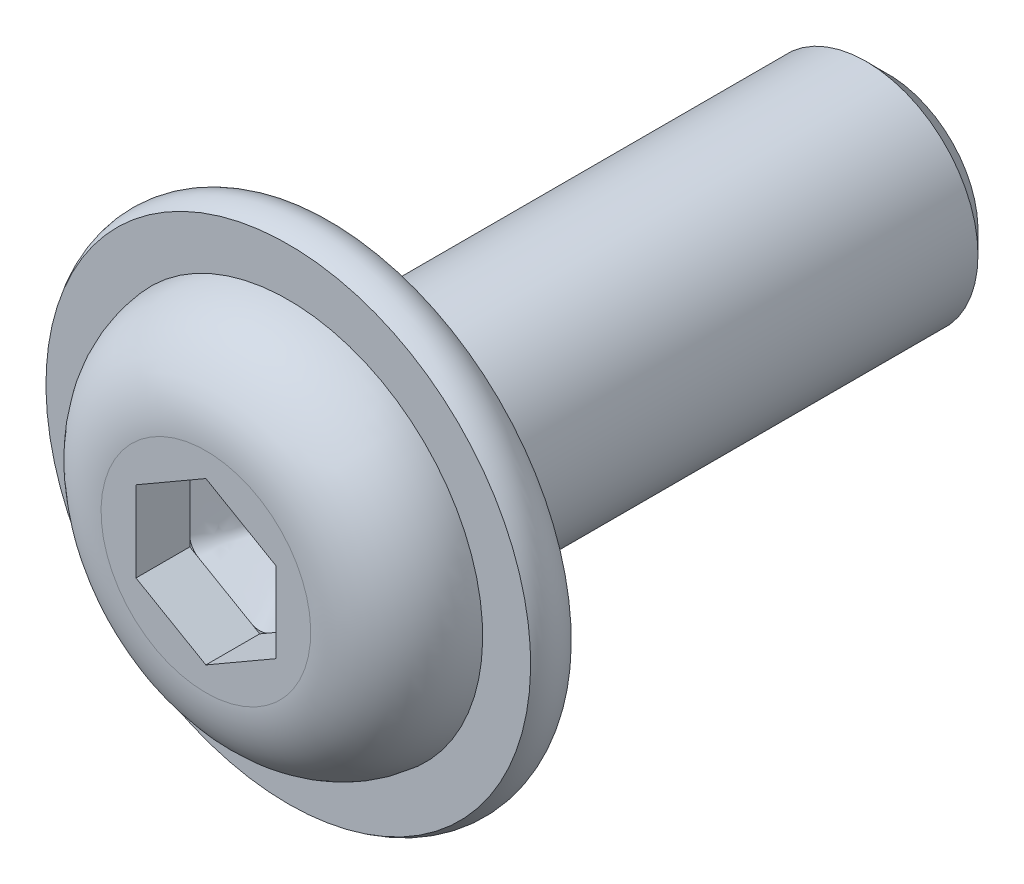
ISO-10303-21;
HEADER;
FILE_DESCRIPTION(('STEP AP214'),'2;1');
FILE_NAME('part.step','',(''),(''),'','','');
FILE_SCHEMA(('AUTOMOTIVE_DESIGN { 1 0 10303 214 1 1 1 1 }'));
ENDSEC;
DATA;
#1=APPLICATION_CONTEXT('core data for automotive mechanical design processes');
#2=APPLICATION_PROTOCOL_DEFINITION('international standard','automotive_design',2000,#1);
#3=PRODUCT_CONTEXT('',#1,'mechanical');
#4=PRODUCT('Part','Part','',(#3));
#5=PRODUCT_RELATED_PRODUCT_CATEGORY('part','',(#4));
#6=PRODUCT_DEFINITION_FORMATION('','',#4);
#7=PRODUCT_DEFINITION_CONTEXT('part definition',#1,'design');
#8=PRODUCT_DEFINITION('design','',#6,#7);
#9=PRODUCT_DEFINITION_SHAPE('','',#8);
#10=(LENGTH_UNIT() NAMED_UNIT(*) SI_UNIT(.MILLI.,.METRE.));
#11=(NAMED_UNIT(*) PLANE_ANGLE_UNIT() SI_UNIT($,.RADIAN.));
#12=(NAMED_UNIT(*) SI_UNIT($,.STERADIAN.) SOLID_ANGLE_UNIT());
#13=UNCERTAINTY_MEASURE_WITH_UNIT(LENGTH_MEASURE(1.E-05),#10,'distance_accuracy_value','');
#14=(GEOMETRIC_REPRESENTATION_CONTEXT(3) GLOBAL_UNCERTAINTY_ASSIGNED_CONTEXT((#13)) GLOBAL_UNIT_ASSIGNED_CONTEXT((#10,
#11,#12)) REPRESENTATION_CONTEXT('',''));
#15=CARTESIAN_POINT('',(0.,0.,0.));
#16=DIRECTION('',(0.,0.,1.));
#17=DIRECTION('',(1.,0.,0.));
#18=AXIS2_PLACEMENT_3D('',#15,#16,#17);
#19=CARTESIAN_POINT('',(0.,0.,10.275));
#20=DIRECTION('',(0.,0.,1.));
#21=DIRECTION('',(1.,0.,0.));
#22=AXIS2_PLACEMENT_3D('',#19,#20,#21);
#23=PLANE('',#22);
#24=CARTESIAN_POINT('',(-1.875,1.08253175473054,10.275));
#25=DIRECTION('',(0.,0.,1.));
#26=DIRECTION('',(1.,0.,0.));
#27=AXIS2_PLACEMENT_3D('',#24,#25,#26);
#28=CIRCLE('',#27,0.625);
#29=CARTESIAN_POINT('',(-2.1875,1.62379763209582,10.275));
#30=VERTEX_POINT('',#29);
#31=CARTESIAN_POINT('',(-2.5,1.08253175475083,10.275));
#32=VERTEX_POINT('',#31);
#33=EDGE_CURVE('E518',#30,#32,#28,.T.);
#34=ORIENTED_EDGE('',*,*,#33,.F.);
#35=DIRECTION('',(-0.866025403784438,-0.5,0.));
#36=VECTOR('',#35,1.);
#37=CARTESIAN_POINT('',(0.,2.88675134594813,10.275));
#38=LINE('',#37,#36);
#39=CARTESIAN_POINT('',(-2.5,1.44337567297406,10.275));
#40=VERTEX_POINT('',#39);
#41=EDGE_CURVE('E371',#30,#40,#38,.T.);
#42=ORIENTED_EDGE('',*,*,#41,.T.);
#43=DIRECTION('',(0.,-1.,0.));
#44=VECTOR('',#43,1.);
#45=CARTESIAN_POINT('',(-2.5,1.44337567297406,10.275));
#46=LINE('',#45,#44);
#47=EDGE_CURVE('E380',#40,#32,#46,.T.);
#48=ORIENTED_EDGE('',*,*,#47,.T.);
#49=EDGE_LOOP('',(#34,#42,#48));
#50=FACE_BOUND('',#49,.T.);
#51=ADVANCED_FACE('F261',(#50),#23,.T.);
#52=CARTESIAN_POINT('',(-1.875,-1.08253175473055,10.275));
#53=DIRECTION('',(0.,0.,1.));
#54=DIRECTION('',(-1.,0.,0.));
#55=AXIS2_PLACEMENT_3D('',#52,#53,#54);
#56=CIRCLE('',#55,0.625);
#57=CARTESIAN_POINT('',(-2.5,-1.08253175480025,10.275));
#58=VERTEX_POINT('',#57);
#59=CARTESIAN_POINT('',(-2.18749999999958,-1.62379763209607,10.275));
#60=VERTEX_POINT('',#59);
#61=EDGE_CURVE('E509',#58,#60,#56,.T.);
#62=ORIENTED_EDGE('',*,*,#61,.F.);
#63=CARTESIAN_POINT('',(-2.5,-1.44337567297407,10.275));
#64=VERTEX_POINT('',#63);
#65=EDGE_CURVE('E378',#58,#64,#46,.T.);
#66=ORIENTED_EDGE('',*,*,#65,.T.);
#67=DIRECTION('',(0.866025403784439,-0.5,0.));
#68=VECTOR('',#67,1.);
#69=CARTESIAN_POINT('',(-2.5,-1.44337567297407,10.275));
#70=LINE('',#69,#68);
#71=EDGE_CURVE('E403',#64,#60,#70,.T.);
#72=ORIENTED_EDGE('',*,*,#71,.T.);
#73=EDGE_LOOP('',(#62,#66,#72));
#74=FACE_BOUND('',#73,.T.);
#75=ADVANCED_FACE('F696',(#74),#23,.T.);
#76=CARTESIAN_POINT('',(0.,-2.1650635094611,10.275));
#77=DIRECTION('',(0.,0.,1.));
#78=DIRECTION('',(1.,0.,0.));
#79=AXIS2_PLACEMENT_3D('',#76,#77,#78);
#80=CIRCLE('',#79,0.625);
#81=CARTESIAN_POINT('',(-0.312500000027832,-2.7063293868103,10.275));
#82=VERTEX_POINT('',#81);
#83=CARTESIAN_POINT('',(0.31250000005148,-2.70632938679665,10.275));
#84=VERTEX_POINT('',#83);
#85=EDGE_CURVE('E583',#82,#84,#80,.T.);
#86=ORIENTED_EDGE('',*,*,#85,.F.);
#87=CARTESIAN_POINT('',(0.,-2.88675134594814,10.275));
#88=VERTEX_POINT('',#87);
#89=EDGE_CURVE('E400',#82,#88,#70,.T.);
#90=ORIENTED_EDGE('',*,*,#89,.T.);
#91=DIRECTION('',(0.866025403784438,0.5,0.));
#92=VECTOR('',#91,1.);
#93=CARTESIAN_POINT('',(0.,-2.88675134594814,10.275));
#94=LINE('',#93,#92);
#95=EDGE_CURVE('E413',#88,#84,#94,.T.);
#96=ORIENTED_EDGE('',*,*,#95,.T.);
#97=EDGE_LOOP('',(#86,#90,#96));
#98=FACE_BOUND('',#97,.T.);
#99=ADVANCED_FACE('F700',(#98),#23,.T.);
#100=CARTESIAN_POINT('',(1.875,-1.08253175473055,10.275));
#101=DIRECTION('',(0.,0.,1.));
#102=DIRECTION('',(1.,0.,0.));
#103=AXIS2_PLACEMENT_3D('',#100,#101,#102);
#104=CIRCLE('',#103,0.625);
#105=CARTESIAN_POINT('',(2.18750000000772,-1.62379763209137,10.275));
#106=VERTEX_POINT('',#105);
#107=CARTESIAN_POINT('',(2.5,-1.08253175475084,10.275));
#108=VERTEX_POINT('',#107);
#109=EDGE_CURVE('E548',#106,#108,#104,.T.);
#110=ORIENTED_EDGE('',*,*,#109,.F.);
#111=CARTESIAN_POINT('',(2.5,-1.44337567297407,10.275));
#112=VERTEX_POINT('',#111);
#113=EDGE_CURVE('E411',#106,#112,#94,.T.);
#114=ORIENTED_EDGE('',*,*,#113,.T.);
#115=DIRECTION('',(0.,1.,0.));
#116=VECTOR('',#115,1.);
#117=CARTESIAN_POINT('',(2.5,-1.44337567297407,10.275));
#118=LINE('',#117,#116);
#119=EDGE_CURVE('E427',#112,#108,#118,.T.);
#120=ORIENTED_EDGE('',*,*,#119,.T.);
#121=EDGE_LOOP('',(#110,#114,#120));
#122=FACE_BOUND('',#121,.T.);
#123=ADVANCED_FACE('F704',(#122),#23,.T.);
#124=CARTESIAN_POINT('',(1.875,1.08253175473054,10.275));
#125=DIRECTION('',(0.,0.,1.));
#126=DIRECTION('',(1.,0.,0.));
#127=AXIS2_PLACEMENT_3D('',#124,#125,#126);
#128=CIRCLE('',#127,0.625);
#129=CARTESIAN_POINT('',(2.5,1.08253175480024,10.275));
#130=VERTEX_POINT('',#129);
#131=CARTESIAN_POINT('',(2.18749999999958,1.62379763209606,10.275));
#132=VERTEX_POINT('',#131);
#133=EDGE_CURVE('E441',#130,#132,#128,.T.);
#134=ORIENTED_EDGE('',*,*,#133,.F.);
#135=CARTESIAN_POINT('',(2.5,1.44337567297406,10.275));
#136=VERTEX_POINT('',#135);
#137=EDGE_CURVE('E415',#130,#136,#118,.T.);
#138=ORIENTED_EDGE('',*,*,#137,.T.);
#139=DIRECTION('',(-0.866025403784439,0.5,0.));
#140=VECTOR('',#139,1.);
#141=CARTESIAN_POINT('',(2.5,1.44337567297406,10.275));
#142=LINE('',#141,#140);
#143=EDGE_CURVE('E432',#136,#132,#142,.T.);
#144=ORIENTED_EDGE('',*,*,#143,.T.);
#145=EDGE_LOOP('',(#134,#138,#144));
#146=FACE_BOUND('',#145,.T.);
#147=ADVANCED_FACE('F439',(#146),#23,.T.);
#148=CARTESIAN_POINT('',(0.,0.,12.2));
#149=DIRECTION('',(0.,0.,-1.));
#150=DIRECTION('',(0.,1.,0.));
#151=AXIS2_PLACEMENT_3D('',#148,#149,#150);
#152=PLANE('',#151);
#153=DIRECTION('',(0.,-1.,0.));
#154=VECTOR('',#153,1.);
#155=CARTESIAN_POINT('',(-2.5,1.44337567297406,12.2));
#156=LINE('',#155,#154);
#157=CARTESIAN_POINT('',(-2.5,1.44337567297406,12.2));
#158=VERTEX_POINT('',#157);
#159=CARTESIAN_POINT('',(-2.5,-1.44337567297407,12.2));
#160=VERTEX_POINT('',#159);
#161=EDGE_CURVE('E621',#158,#160,#156,.T.);
#162=ORIENTED_EDGE('',*,*,#161,.F.);
#163=DIRECTION('',(-0.866025403784438,-0.5,0.));
#164=VECTOR('',#163,1.);
#165=CARTESIAN_POINT('',(0.,2.88675134594813,12.2));
#166=LINE('',#165,#164);
#167=CARTESIAN_POINT('',(0.,2.88675134594813,12.2));
#168=VERTEX_POINT('',#167);
#169=EDGE_CURVE('E287',#168,#158,#166,.T.);
#170=ORIENTED_EDGE('',*,*,#169,.F.);
#171=DIRECTION('',(-0.866025403784439,0.5,0.));
#172=VECTOR('',#171,1.);
#173=CARTESIAN_POINT('',(2.5,1.44337567297406,12.2));
#174=LINE('',#173,#172);
#175=CARTESIAN_POINT('',(2.5,1.44337567297406,12.2));
#176=VERTEX_POINT('',#175);
#177=EDGE_CURVE('E382',#176,#168,#174,.T.);
#178=ORIENTED_EDGE('',*,*,#177,.F.);
#179=DIRECTION('',(0.,1.,0.));
#180=VECTOR('',#179,1.);
#181=CARTESIAN_POINT('',(2.5,-1.44337567297407,12.2));
#182=LINE('',#181,#180);
#183=CARTESIAN_POINT('',(2.5,-1.44337567297407,12.2));
#184=VERTEX_POINT('',#183);
#185=EDGE_CURVE('E449',#184,#176,#182,.T.);
#186=ORIENTED_EDGE('',*,*,#185,.F.);
#187=DIRECTION('',(0.866025403784438,0.5,0.));
#188=VECTOR('',#187,1.);
#189=CARTESIAN_POINT('',(0.,-2.88675134594814,12.2));
#190=LINE('',#189,#188);
#191=CARTESIAN_POINT('',(0.,-2.88675134594814,12.2));
#192=VERTEX_POINT('',#191);
#193=EDGE_CURVE('E628',#192,#184,#190,.T.);
#194=ORIENTED_EDGE('',*,*,#193,.F.);
#195=DIRECTION('',(0.866025403784439,-0.5,0.));
#196=VECTOR('',#195,1.);
#197=CARTESIAN_POINT('',(-2.5,-1.44337567297407,12.2));
#198=LINE('',#197,#196);
#199=EDGE_CURVE('E623',#160,#192,#198,.T.);
#200=ORIENTED_EDGE('',*,*,#199,.F.);
#201=EDGE_LOOP('',(#162,#170,#178,#186,#194,#200));
#202=FACE_BOUND('',#201,.T.);
#203=CARTESIAN_POINT('',(0.,0.,12.2));
#204=DIRECTION('',(0.,0.,1.));
#205=DIRECTION('',(0.,-1.,0.));
#206=AXIS2_PLACEMENT_3D('',#203,#204,#205);
#207=CIRCLE('',#206,3.75);
#208=CARTESIAN_POINT('',(0.,-3.75000000000001,12.2));
#209=VERTEX_POINT('',#208);
#210=EDGE_CURVE('E12',#209,#209,#207,.T.);
#211=ORIENTED_EDGE('',*,*,#210,.T.);
#212=EDGE_LOOP('',(#211));
#213=FACE_BOUND('',#212,.T.);
#214=ADVANCED_FACE('F263',(#202,#213),#152,.F.);
#215=CARTESIAN_POINT('',(0.,0.,8.98631899891452));
#216=DIRECTION('',(0.,0.,1.));
#217=DIRECTION('',(0.,-1.,0.));
#218=AXIS2_PLACEMENT_3D('',#215,#216,#217);
#219=TOROIDAL_SURFACE('',#218,3.75,3.21368100108548);
#220=ORIENTED_EDGE('',*,*,#210,.F.);
#221=EDGE_LOOP('',(#220));
#222=FACE_BOUND('',#221,.T.);
#223=CARTESIAN_POINT('',(0.,0.,9.252));
#224=DIRECTION('',(0.,0.,1.));
#225=DIRECTION('',(0.,-1.,0.));
#226=AXIS2_PLACEMENT_3D('',#223,#224,#225);
#227=CIRCLE('',#226,6.95268);
#228=CARTESIAN_POINT('',(0.,-6.95268000000001,9.252));
#229=VERTEX_POINT('',#228);
#230=EDGE_CURVE('E271',#229,#229,#227,.T.);
#231=ORIENTED_EDGE('',*,*,#230,.T.);
#232=EDGE_LOOP('',(#231));
#233=FACE_BOUND('',#232,.T.);
#234=ADVANCED_FACE('F655',(#222,#233),#219,.T.);
#235=CARTESIAN_POINT('',(0.,8.6686,9.252));
#236=DIRECTION('',(0.,0.,-1.));
#237=DIRECTION('',(0.,1.,0.));
#238=AXIS2_PLACEMENT_3D('',#235,#236,#237);
#239=PLANE('',#238);
#240=ORIENTED_EDGE('',*,*,#230,.F.);
#241=EDGE_LOOP('',(#240));
#242=FACE_BOUND('',#241,.T.);
#243=CARTESIAN_POINT('',(0.,0.,9.252));
#244=DIRECTION('',(0.,0.,1.));
#245=DIRECTION('',(0.,-1.,0.));
#246=AXIS2_PLACEMENT_3D('',#243,#244,#245);
#247=CIRCLE('',#246,8.6686);
#248=CARTESIAN_POINT('',(0.,-8.6686,9.252));
#249=VERTEX_POINT('',#248);
#250=EDGE_CURVE('E650',#249,#249,#247,.T.);
#251=ORIENTED_EDGE('',*,*,#250,.T.);
#252=EDGE_LOOP('',(#251));
#253=FACE_BOUND('',#252,.T.);
#254=ADVANCED_FACE('F657',(#242,#253),#239,.F.);
#255=CARTESIAN_POINT('',(0.,0.,8.526));
#256=DIRECTION('',(0.,0.,1.));
#257=DIRECTION('',(0.,-1.,0.));
#258=AXIS2_PLACEMENT_3D('',#255,#256,#257);
#259=TOROIDAL_SURFACE('',#258,7.64541495246326,1.25458504753674);
#260=ORIENTED_EDGE('',*,*,#250,.F.);
#261=EDGE_LOOP('',(#260));
#262=FACE_BOUND('',#261,.T.);
#263=CARTESIAN_POINT('',(0.,0.,7.8));
#264=DIRECTION('',(0.,0.,1.));
#265=DIRECTION('',(0.,-1.,0.));
#266=AXIS2_PLACEMENT_3D('',#263,#264,#265);
#267=CIRCLE('',#266,8.6686);
#268=CARTESIAN_POINT('',(0.,-8.6686,7.8));
#269=VERTEX_POINT('',#268);
#270=EDGE_CURVE('E647',#269,#269,#267,.T.);
#271=ORIENTED_EDGE('',*,*,#270,.T.);
#272=EDGE_LOOP('',(#271));
#273=FACE_BOUND('',#272,.T.);
#274=ADVANCED_FACE('F660',(#262,#273),#259,.T.);
#275=CARTESIAN_POINT('',(0.,4.,7.8));
#276=DIRECTION('',(0.,0.,1.));
#277=DIRECTION('',(0.,-1.,0.));
#278=AXIS2_PLACEMENT_3D('',#275,#276,#277);
#279=PLANE('',#278);
#280=ORIENTED_EDGE('',*,*,#270,.F.);
#281=EDGE_LOOP('',(#280));
#282=FACE_BOUND('',#281,.T.);
#283=CARTESIAN_POINT('',(0.,0.,7.8));
#284=DIRECTION('',(0.,0.,1.));
#285=DIRECTION('',(0.,-1.,0.));
#286=AXIS2_PLACEMENT_3D('',#283,#284,#285);
#287=CIRCLE('',#286,4.);
#288=CARTESIAN_POINT('',(0.,-4.00000000000001,7.8));
#289=VERTEX_POINT('',#288);
#290=EDGE_CURVE('E644',#289,#289,#287,.T.);
#291=ORIENTED_EDGE('',*,*,#290,.T.);
#292=EDGE_LOOP('',(#291));
#293=FACE_BOUND('',#292,.T.);
#294=ADVANCED_FACE('F666',(#282,#293),#279,.F.);
#295=CARTESIAN_POINT('',(0.,0.,12.2));
#296=DIRECTION('',(0.,0.,1.));
#297=DIRECTION('',(0.,-1.,0.));
#298=AXIS2_PLACEMENT_3D('',#295,#296,#297);
#299=CYLINDRICAL_SURFACE('',#298,4.);
#300=ORIENTED_EDGE('',*,*,#290,.F.);
#301=EDGE_LOOP('',(#300));
#302=FACE_BOUND('',#301,.T.);
#303=CARTESIAN_POINT('',(0.,0.,-11.41875));
#304=DIRECTION('',(0.,0.,1.));
#305=DIRECTION('',(0.,-1.,0.));
#306=AXIS2_PLACEMENT_3D('',#303,#304,#305);
#307=CIRCLE('',#306,4.);
#308=CARTESIAN_POINT('',(0.,-4.,-11.41875));
#309=VERTEX_POINT('',#308);
#310=EDGE_CURVE('E641',#309,#309,#307,.T.);
#311=ORIENTED_EDGE('',*,*,#310,.T.);
#312=EDGE_LOOP('',(#311));
#313=FACE_BOUND('',#312,.T.);
#314=ADVANCED_FACE('F672',(#302,#313),#299,.T.);
#315=CARTESIAN_POINT('',(0.,0.,-12.2));
#316=DIRECTION('',(0.,0.,1.));
#317=DIRECTION('',(0.,-1.,0.));
#318=AXIS2_PLACEMENT_3D('',#315,#316,#317);
#319=CONICAL_SURFACE('',#318,3.21875000000001,0.785398163397445);
#320=ORIENTED_EDGE('',*,*,#310,.F.);
#321=EDGE_LOOP('',(#320));
#322=FACE_BOUND('',#321,.T.);
#323=CARTESIAN_POINT('',(0.,0.,-12.2));
#324=DIRECTION('',(0.,0.,1.));
#325=DIRECTION('',(0.,-1.,0.));
#326=AXIS2_PLACEMENT_3D('',#323,#324,#325);
#327=CIRCLE('',#326,3.21875000000001);
#328=CARTESIAN_POINT('',(0.,-3.21875000000001,-12.2));
#329=VERTEX_POINT('',#328);
#330=EDGE_CURVE('E633',#329,#329,#327,.T.);
#331=ORIENTED_EDGE('',*,*,#330,.T.);
#332=EDGE_LOOP('',(#331));
#333=FACE_BOUND('',#332,.T.);
#334=ADVANCED_FACE('F678',(#322,#333),#319,.T.);
#335=CARTESIAN_POINT('',(0.,3.21875000000001,-12.2));
#336=DIRECTION('',(0.,0.,1.));
#337=DIRECTION('',(0.,-1.,0.));
#338=AXIS2_PLACEMENT_3D('',#335,#336,#337);
#339=PLANE('',#338);
#340=ORIENTED_EDGE('',*,*,#330,.F.);
#341=EDGE_LOOP('',(#340));
#342=FACE_BOUND('',#341,.T.);
#343=ADVANCED_FACE('F684',(#342),#339,.F.);
#344=CARTESIAN_POINT('',(0.,2.88675134594813,10.275));
#345=DIRECTION('',(-0.5,0.866025403784439,0.));
#346=DIRECTION('',(-0.866025403784439,-0.5,0.));
#347=AXIS2_PLACEMENT_3D('',#344,#345,#346);
#348=PLANE('',#347);
#349=ORIENTED_EDGE('',*,*,#169,.T.);
#350=DIRECTION('',(0.,0.,1.));
#351=VECTOR('',#350,1.);
#352=CARTESIAN_POINT('',(-2.5,1.44337567297406,10.275));
#353=LINE('',#352,#351);
#354=EDGE_CURVE('E458',#40,#158,#353,.T.);
#355=ORIENTED_EDGE('',*,*,#354,.F.);
#356=ORIENTED_EDGE('',*,*,#41,.F.);
#357=DIRECTION('',(-0.866025403784439,-0.5,0.));
#358=VECTOR('',#357,1.);
#359=CARTESIAN_POINT('',(-0.312499999999999,2.70632938682636,10.275));
#360=LINE('',#359,#358);
#361=CARTESIAN_POINT('',(-0.312499999999999,2.70632938682636,10.275));
#362=VERTEX_POINT('',#361);
#363=EDGE_CURVE('E356',#362,#30,#360,.T.);
#364=ORIENTED_EDGE('',*,*,#363,.F.);
#365=CARTESIAN_POINT('',(0.,2.88675134594813,10.275));
#366=VERTEX_POINT('',#365);
#367=EDGE_CURVE('E370',#366,#362,#38,.T.);
#368=ORIENTED_EDGE('',*,*,#367,.F.);
#369=DIRECTION('',(0.,0.,1.));
#370=VECTOR('',#369,1.);
#371=CARTESIAN_POINT('',(0.,2.88675134594813,10.275));
#372=LINE('',#371,#370);
#373=EDGE_CURVE('E453',#366,#168,#372,.T.);
#374=ORIENTED_EDGE('',*,*,#373,.T.);
#375=EDGE_LOOP('',(#349,#355,#356,#364,#368,#374));
#376=FACE_BOUND('',#375,.T.);
#377=ADVANCED_FACE('F369',(#376),#348,.F.);
#378=CARTESIAN_POINT('',(2.5,1.44337567297406,10.275));
#379=DIRECTION('',(0.5,0.866025403784439,0.));
#380=DIRECTION('',(-0.866025403784439,0.5,0.));
#381=AXIS2_PLACEMENT_3D('',#378,#379,#380);
#382=PLANE('',#381);
#383=ORIENTED_EDGE('',*,*,#177,.T.);
#384=ORIENTED_EDGE('',*,*,#373,.F.);
#385=CARTESIAN_POINT('',(0.312500000000005,2.70632938682637,10.275));
#386=VERTEX_POINT('',#385);
#387=EDGE_CURVE('E376',#386,#366,#142,.T.);
#388=ORIENTED_EDGE('',*,*,#387,.F.);
#389=DIRECTION('',(-0.866025403784438,0.5,0.));
#390=VECTOR('',#389,1.);
#391=CARTESIAN_POINT('',(2.1875,1.62379763209582,10.275));
#392=LINE('',#391,#390);
#393=EDGE_CURVE('E265',#132,#386,#392,.T.);
#394=ORIENTED_EDGE('',*,*,#393,.F.);
#395=ORIENTED_EDGE('',*,*,#143,.F.);
#396=DIRECTION('',(0.,0.,1.));
#397=VECTOR('',#396,1.);
#398=CARTESIAN_POINT('',(2.5,1.44337567297406,10.275));
#399=LINE('',#398,#397);
#400=EDGE_CURVE('E446',#136,#176,#399,.T.);
#401=ORIENTED_EDGE('',*,*,#400,.T.);
#402=EDGE_LOOP('',(#383,#384,#388,#394,#395,#401));
#403=FACE_BOUND('',#402,.T.);
#404=ADVANCED_FACE('F456',(#403),#382,.F.);
#405=CARTESIAN_POINT('',(2.5,-1.44337567297407,10.275));
#406=DIRECTION('',(1.,0.,0.));
#407=DIRECTION('',(0.,1.,0.));
#408=AXIS2_PLACEMENT_3D('',#405,#406,#407);
#409=PLANE('',#408);
#410=ORIENTED_EDGE('',*,*,#185,.T.);
#411=ORIENTED_EDGE('',*,*,#400,.F.);
#412=ORIENTED_EDGE('',*,*,#137,.F.);
#413=DIRECTION('',(0.,1.,0.));
#414=VECTOR('',#413,1.);
#415=CARTESIAN_POINT('',(2.5,-1.08253175473055,10.275));
#416=LINE('',#415,#414);
#417=EDGE_CURVE('E539',#108,#130,#416,.T.);
#418=ORIENTED_EDGE('',*,*,#417,.F.);
#419=ORIENTED_EDGE('',*,*,#119,.F.);
#420=DIRECTION('',(0.,0.,1.));
#421=VECTOR('',#420,1.);
#422=CARTESIAN_POINT('',(2.5,-1.44337567297407,10.275));
#423=LINE('',#422,#421);
#424=EDGE_CURVE('E454',#112,#184,#423,.T.);
#425=ORIENTED_EDGE('',*,*,#424,.T.);
#426=EDGE_LOOP('',(#410,#411,#412,#418,#419,#425));
#427=FACE_BOUND('',#426,.T.);
#428=ADVANCED_FACE('F447',(#427),#409,.F.);
#429=CARTESIAN_POINT('',(0.,-2.88675134594814,10.275));
#430=DIRECTION('',(0.5,-0.866025403784439,0.));
#431=DIRECTION('',(0.866025403784439,0.5,0.));
#432=AXIS2_PLACEMENT_3D('',#429,#430,#431);
#433=PLANE('',#432);
#434=ORIENTED_EDGE('',*,*,#193,.T.);
#435=ORIENTED_EDGE('',*,*,#424,.F.);
#436=ORIENTED_EDGE('',*,*,#113,.F.);
#437=DIRECTION('',(0.866025403784439,0.5,0.));
#438=VECTOR('',#437,1.);
#439=CARTESIAN_POINT('',(0.312499999999999,-2.70632938682637,10.275));
#440=LINE('',#439,#438);
#441=EDGE_CURVE('E576',#84,#106,#440,.T.);
#442=ORIENTED_EDGE('',*,*,#441,.F.);
#443=ORIENTED_EDGE('',*,*,#95,.F.);
#444=DIRECTION('',(0.,0.,1.));
#445=VECTOR('',#444,1.);
#446=CARTESIAN_POINT('',(0.,-2.88675134594814,10.275));
#447=LINE('',#446,#445);
#448=EDGE_CURVE('E636',#88,#192,#447,.T.);
#449=ORIENTED_EDGE('',*,*,#448,.T.);
#450=EDGE_LOOP('',(#434,#435,#436,#442,#443,#449));
#451=FACE_BOUND('',#450,.T.);
#452=ADVANCED_FACE('F561',(#451),#433,.F.);
#453=CARTESIAN_POINT('',(-2.5,-1.44337567297407,10.275));
#454=DIRECTION('',(-0.5,-0.866025403784439,0.));
#455=DIRECTION('',(0.866025403784439,-0.5,0.));
#456=AXIS2_PLACEMENT_3D('',#453,#454,#455);
#457=PLANE('',#456);
#458=ORIENTED_EDGE('',*,*,#199,.T.);
#459=ORIENTED_EDGE('',*,*,#448,.F.);
#460=ORIENTED_EDGE('',*,*,#89,.F.);
#461=DIRECTION('',(0.866025403784439,-0.5,0.));
#462=VECTOR('',#461,1.);
#463=CARTESIAN_POINT('',(-2.1875,-1.62379763209583,10.275));
#464=LINE('',#463,#462);
#465=EDGE_CURVE('E592',#60,#82,#464,.T.);
#466=ORIENTED_EDGE('',*,*,#465,.F.);
#467=ORIENTED_EDGE('',*,*,#71,.F.);
#468=DIRECTION('',(0.,0.,1.));
#469=VECTOR('',#468,1.);
#470=CARTESIAN_POINT('',(-2.5,-1.44337567297407,10.275));
#471=LINE('',#470,#469);
#472=EDGE_CURVE('E459',#64,#160,#471,.T.);
#473=ORIENTED_EDGE('',*,*,#472,.T.);
#474=EDGE_LOOP('',(#458,#459,#460,#466,#467,#473));
#475=FACE_BOUND('',#474,.T.);
#476=ADVANCED_FACE('F565',(#475),#457,.F.);
#477=CARTESIAN_POINT('',(-2.5,1.44337567297406,10.275));
#478=DIRECTION('',(-1.,0.,0.));
#479=DIRECTION('',(0.,0.,1.));
#480=AXIS2_PLACEMENT_3D('',#477,#478,#479);
#481=PLANE('',#480);
#482=ORIENTED_EDGE('',*,*,#161,.T.);
#483=ORIENTED_EDGE('',*,*,#472,.F.);
#484=ORIENTED_EDGE('',*,*,#65,.F.);
#485=DIRECTION('',(0.,-1.,0.));
#486=VECTOR('',#485,1.);
#487=CARTESIAN_POINT('',(-2.5,1.08253175473054,10.275));
#488=LINE('',#487,#486);
#489=EDGE_CURVE('E521',#32,#58,#488,.T.);
#490=ORIENTED_EDGE('',*,*,#489,.F.);
#491=ORIENTED_EDGE('',*,*,#47,.F.);
#492=ORIENTED_EDGE('',*,*,#354,.T.);
#493=EDGE_LOOP('',(#482,#483,#484,#490,#491,#492));
#494=FACE_BOUND('',#493,.T.);
#495=ADVANCED_FACE('F476',(#494),#481,.F.);
#496=CARTESIAN_POINT('',(0.,2.16506350946109,10.275));
#497=DIRECTION('',(0.,0.,1.));
#498=DIRECTION('',(1.,0.,0.));
#499=AXIS2_PLACEMENT_3D('',#496,#497,#498);
#500=CIRCLE('',#499,0.625);
#501=EDGE_CURVE('E351',#386,#362,#500,.T.);
#502=ORIENTED_EDGE('',*,*,#501,.F.);
#503=ORIENTED_EDGE('',*,*,#387,.T.);
#504=ORIENTED_EDGE('',*,*,#367,.T.);
#505=EDGE_LOOP('',(#502,#503,#504));
#506=FACE_BOUND('',#505,.T.);
#507=ADVANCED_FACE('F375',(#506),#23,.T.);
#508=CARTESIAN_POINT('',(0.,0.,8.526));
#509=DIRECTION('',(0.,0.,1.));
#510=DIRECTION('',(1.,0.,0.));
#511=AXIS2_PLACEMENT_3D('',#508,#509,#510);
#512=PLANE('',#511);
#513=CARTESIAN_POINT('',(0.,0.,8.526));
#514=DIRECTION('',(0.,0.,1.));
#515=DIRECTION('',(1.,0.,0.));
#516=AXIS2_PLACEMENT_3D('',#513,#514,#515);
#517=CIRCLE('',#516,0.175);
#518=CARTESIAN_POINT('',(0.175,0.,8.526));
#519=VERTEX_POINT('',#518);
#520=EDGE_CURVE('E372',#519,#519,#517,.T.);
#521=ORIENTED_EDGE('',*,*,#520,.T.);
#522=EDGE_LOOP('',(#521));
#523=FACE_BOUND('',#522,.T.);
#524=ADVANCED_FACE('F475',(#523),#512,.T.);
#525=CARTESIAN_POINT('',(0.312500000273664,2.70632938666836,10.275));
#526=CARTESIAN_POINT('',(0.0200738766966503,0.17384487186675,8.526));
#527=CARTESIAN_POINT('',(0.470028749259429,2.61538012103633,10.275));
#528=CARTESIAN_POINT('',(0.0318184717452628,0.172488722844182,8.526));
#529=CARTESIAN_POINT('',(0.783145089334924,2.43460231780606,10.275));
#530=CARTESIAN_POINT('',(0.0551747739118185,0.167367870211436,8.52599999999999));
#531=CARTESIAN_POINT('',(1.25,2.16506350946109,10.275));
#532=CARTESIAN_POINT('',(0.0881174254107773,0.152623857843624,8.52600000000001));
#533=CARTESIAN_POINT('',(1.71685491066507,1.89552470111611,10.275));
#534=CARTESIAN_POINT('',(0.117357440424493,0.131466690961414,8.52599999999999));
#535=CARTESIAN_POINT('',(2.02997125074057,1.71474689788585,10.275));
#536=CARTESIAN_POINT('',(0.133470379976766,0.113799966263084,8.526));
#537=CARTESIAN_POINT('',(2.23345560883067,1.59726514896665,10.275));
#538=CARTESIAN_POINT('',(0.142572876123845,0.101537532861186,8.526));
#539=CARTESIAN_POINT('',(2.3204287551678,1.53128704145715,10.275));
#540=CARTESIAN_POINT('',(0.146432390834959,0.0959986177038104,8.526));
#541=CARTESIAN_POINT('',(2.42272823404165,1.39873990564613,10.275));
#542=CARTESIAN_POINT('',(0.151635181272801,0.0875466127264664,8.526));
#543=CARTESIAN_POINT('',(2.48634129586638,1.243918233549,10.275));
#544=CARTESIAN_POINT('',(0.156353437077172,0.078814861548056,8.526));
#545=CARTESIAN_POINT('',(2.5,1.13559672098887,10.275));
#546=CARTESIAN_POINT('',(0.15922052095731,0.0727029661832637,8.526));
#547=CARTESIAN_POINT('',(2.5,0.90063322315047,10.275));
#548=CARTESIAN_POINT('',(0.165288851722029,0.0586887565810946,8.526));
#549=CARTESIAN_POINT('',(2.5,0.539077616689953,10.275));
#550=CARTESIAN_POINT('',(0.172532214336312,0.0359011792500186,8.52599999999999));
#551=CARTESIAN_POINT('',(2.5,0.,10.275));
#552=CARTESIAN_POINT('',(0.176234850821554,0.,8.52600000000001));
#553=CARTESIAN_POINT('',(2.49999999999999,-0.539077616689964,10.275));
#554=CARTESIAN_POINT('',(0.172532214336312,-0.0359011792500245,8.52599999999999));
#555=CARTESIAN_POINT('',(2.5,-0.90063322315048,10.275));
#556=CARTESIAN_POINT('',(0.165288851722029,-0.0586887565811006,8.526));
#557=CARTESIAN_POINT('',(2.5,-1.13559672098888,10.275));
#558=CARTESIAN_POINT('',(0.15922052095731,-0.0727029661832697,8.526));
#559=CARTESIAN_POINT('',(2.48634785597171,-1.24390672891864,10.275));
#560=CARTESIAN_POINT('',(0.156353437077172,-0.0788148615480621,8.52599999999999));
#561=CARTESIAN_POINT('',(2.42270840859743,-1.39877424432282,10.275));
#562=CARTESIAN_POINT('',(0.151635181272801,-0.0875466127264723,8.52600000000001));
#563=CARTESIAN_POINT('',(2.32043543841729,-1.53127560792411,10.275));
#564=CARTESIAN_POINT('',(0.146432390834958,-0.0959986177038164,8.52599999999999));
#565=CARTESIAN_POINT('',(2.23345560883067,-1.59726514896666,10.275));
#566=CARTESIAN_POINT('',(0.142572876123845,-0.101537532861192,8.526));
#567=CARTESIAN_POINT('',(2.02997125074057,-1.71474689788586,10.275));
#568=CARTESIAN_POINT('',(0.133470379976766,-0.11379996626309,8.526));
#569=CARTESIAN_POINT('',(1.71685491066507,-1.89552470111612,10.275));
#570=CARTESIAN_POINT('',(0.117357440424493,-0.13146669096142,8.526));
#571=CARTESIAN_POINT('',(1.25,-2.1650635094611,10.275));
#572=CARTESIAN_POINT('',(0.088117425410777,-0.15262385784363,8.52599999999999));
#573=CARTESIAN_POINT('',(0.783145089334924,-2.43460231780608,10.275));
#574=CARTESIAN_POINT('',(0.0551747739118186,-0.167367870211441,8.52600000000001));
#575=CARTESIAN_POINT('',(0.470028749259428,-2.61538012103634,10.275));
#576=CARTESIAN_POINT('',(0.0318184717452627,-0.172488722844188,8.526));
#577=CARTESIAN_POINT('',(0.266544391169326,-2.73286186995553,10.275));
#578=CARTESIAN_POINT('',(0.0166476448334649,-0.174240499044459,8.526));
#579=CARTESIAN_POINT('',(0.165919100803913,-2.7751937703758,10.275));
#580=CARTESIAN_POINT('',(0.00992104624221364,-0.174813479251875,8.526));
#581=CARTESIAN_POINT('',(-1.98254442262236E-05,-2.79751414996895,10.275));
#582=CARTESIAN_POINT('',(0.,-0.175093225452942,8.526));
#583=CARTESIAN_POINT('',(-0.165905857449089,-2.77519384147312,10.275));
#584=CARTESIAN_POINT('',(-0.00992104624221372,-0.174813479251875,8.526));
#585=CARTESIAN_POINT('',(-0.266544391169328,-2.73286186995553,10.275));
#586=CARTESIAN_POINT('',(-0.016647644833465,-0.174240499044459,8.526));
#587=CARTESIAN_POINT('',(-0.470028749259429,-2.61538012103634,10.275));
#588=CARTESIAN_POINT('',(-0.0318184717452627,-0.172488722844188,8.526));
#589=CARTESIAN_POINT('',(-0.783145089334925,-2.43460231780608,10.275));
#590=CARTESIAN_POINT('',(-0.0551747739118185,-0.167367870211442,8.52599999999999));
#591=CARTESIAN_POINT('',(-1.25,-2.1650635094611,10.275));
#592=CARTESIAN_POINT('',(-0.0881174254107772,-0.15262385784363,8.526));
#593=CARTESIAN_POINT('',(-1.71685491066507,-1.89552470111612,10.275));
#594=CARTESIAN_POINT('',(-0.117357440424493,-0.13146669096142,8.526));
#595=CARTESIAN_POINT('',(-2.02997125074057,-1.71474689788586,10.275));
#596=CARTESIAN_POINT('',(-0.133470379976766,-0.11379996626309,8.526));
#597=CARTESIAN_POINT('',(-2.23345560883067,-1.59726514896666,10.275));
#598=CARTESIAN_POINT('',(-0.142572876123845,-0.101537532861192,8.526));
#599=CARTESIAN_POINT('',(-2.3204287551678,-1.53128704145716,10.275));
#600=CARTESIAN_POINT('',(-0.146432390834959,-0.0959986177038162,8.526));
#601=CARTESIAN_POINT('',(-2.42272823404165,-1.39873990564614,10.275));
#602=CARTESIAN_POINT('',(-0.151635181272801,-0.0875466127264724,8.526));
#603=CARTESIAN_POINT('',(-2.48634129586638,-1.24391823354901,10.275));
#604=CARTESIAN_POINT('',(-0.156353437077172,-0.0788148615480618,8.526));
#605=CARTESIAN_POINT('',(-2.5,-1.13559672098888,10.275));
#606=CARTESIAN_POINT('',(-0.15922052095731,-0.0727029661832696,8.526));
#607=CARTESIAN_POINT('',(-2.5,-0.90063322315048,10.275));
#608=CARTESIAN_POINT('',(-0.165288851722029,-0.0586887565811005,8.526));
#609=CARTESIAN_POINT('',(-2.49999999999999,-0.539077616689962,10.275));
#610=CARTESIAN_POINT('',(-0.172532214336312,-0.0359011792500245,8.526));
#611=CARTESIAN_POINT('',(-2.5,0.,10.275));
#612=CARTESIAN_POINT('',(-0.176234850821554,0.,8.52599999999999));
#613=CARTESIAN_POINT('',(-2.49999999999999,0.539077616689954,10.275));
#614=CARTESIAN_POINT('',(-0.172532214336312,0.0359011792500186,8.52600000000001));
#615=CARTESIAN_POINT('',(-2.5,0.90063322315047,10.275));
#616=CARTESIAN_POINT('',(-0.165288851722029,0.0586887565810946,8.526));
#617=CARTESIAN_POINT('',(-2.5,1.13559672098887,10.275));
#618=CARTESIAN_POINT('',(-0.15922052095731,0.0727029661832636,8.526));
#619=CARTESIAN_POINT('',(-2.48634785597171,1.24390672891863,10.275));
#620=CARTESIAN_POINT('',(-0.156353437077172,0.0788148615480561,8.526));
#621=CARTESIAN_POINT('',(-2.42270840859743,1.39877424432281,10.275));
#622=CARTESIAN_POINT('',(-0.151635181272801,0.0875466127264661,8.526));
#623=CARTESIAN_POINT('',(-2.32043543841729,1.5312756079241,10.275));
#624=CARTESIAN_POINT('',(-0.146432390834959,0.0959986177038105,8.526));
#625=CARTESIAN_POINT('',(-2.23345560883067,1.59726514896665,10.275));
#626=CARTESIAN_POINT('',(-0.142572876123845,0.101537532861186,8.526));
#627=CARTESIAN_POINT('',(-2.02997125074057,1.71474689788585,10.275));
#628=CARTESIAN_POINT('',(-0.133470379976766,0.113799966263084,8.526));
#629=CARTESIAN_POINT('',(-1.71685491066507,1.89552470111611,10.275));
#630=CARTESIAN_POINT('',(-0.117357440424493,0.131466690961414,8.526));
#631=CARTESIAN_POINT('',(-1.25,2.16506350946109,10.275));
#632=CARTESIAN_POINT('',(-0.0881174254107771,0.152623857843624,8.526));
#633=CARTESIAN_POINT('',(-0.783145089334924,2.43460231780607,10.275));
#634=CARTESIAN_POINT('',(-0.0551747739118184,0.167367870211436,8.526));
#635=CARTESIAN_POINT('',(-0.470028749259427,2.61538012103633,10.275));
#636=CARTESIAN_POINT('',(-0.0318184717452626,0.172488722844182,8.526));
#637=CARTESIAN_POINT('',(-0.266544391169326,2.73286186995552,10.275));
#638=CARTESIAN_POINT('',(-0.0166476448334648,0.174240499044453,8.526));
#639=CARTESIAN_POINT('',(-0.165919100803913,2.77519377037579,10.275));
#640=CARTESIAN_POINT('',(-0.00992104624221347,0.174813479251869,8.52599999999999));
#641=CARTESIAN_POINT('',(1.98254442265624E-05,2.79751414996894,10.275));
#642=CARTESIAN_POINT('',(0.,0.175093225452936,8.526));
#643=CARTESIAN_POINT('',(0.165905857449089,2.7751938414731,10.275));
#644=CARTESIAN_POINT('',(0.00992104624221384,0.174813479251869,8.526));
#645=CARTESIAN_POINT('',(0.266544391169328,2.73286186995552,10.275));
#646=CARTESIAN_POINT('',(0.016647644833465,0.174240499044453,8.526));
#647=CARTESIAN_POINT('',(0.312500000273664,2.70632938666836,10.275));
#648=CARTESIAN_POINT('',(0.0200738766966503,0.17384487186675,8.526));
#649=B_SPLINE_SURFACE_WITH_KNOTS('',3,1,((#525,#526),(#527,#528),(#529,#530),(#531,#532),(#533,
#534),(#535,#536),(#537,#538),(#539,#540),(#541,#542),(#543,#544),(#545,#546),(#547,#548),(#549,
#550),(#551,#552),(#553,#554),(#555,#556),(#557,#558),(#559,#560),(#561,#562),(#563,#564),(#565,
#566),(#567,#568),(#569,#570),(#571,#572),(#573,#574),(#575,#576),(#577,#578),(#579,#580),(#581,
#582),(#583,#584),(#585,#586),(#587,#588),(#589,#590),(#591,#592),(#593,#594),(#595,#596),(#597,
#598),(#599,#600),(#601,#602),(#603,#604),(#605,#606),(#607,#608),(#609,#610),(#611,#612),(#613,
#614),(#615,#616),(#617,#618),(#619,#620),(#621,#622),(#623,#624),(#625,#626),(#627,#628),(#629,
#630),(#631,#632),(#633,#634),(#635,#636),(#637,#638),(#639,#640),(#641,#642),(#643,#644),(#645,
#646),(#647,#648)),.UNSPECIFIED.,.T.,.F.,.F.,(4,1,1,1,2,1,1,1,2,1,1,1,2,1,1,1,2,1,1,1,2,1,1,1,2,
1,1,1,2,1,1,1,2,1,1,1,2,1,1,1,2,1,1,1,2,1,1,1,4),(2,2),(0.,0.0322565229878777,
0.0645130459757554,0.0967695689636332,0.129026091951511,0.1384362356303,0.147846379309089,
0.157256522987878,0.166666666666667,0.198923189654544,0.231179712642422,0.2634362356303,
0.295692758618178,0.305102902296966,0.314513045975755,0.323923189654544,0.333333333333333,
0.365589856321211,0.397846379309089,0.430102902296966,0.462359425284844,0.471769568963633,
0.481179712642422,0.490589856321211,0.5,0.532256522987878,0.564513045975755,0.596769568963633,
0.629026091951511,0.6384362356303,0.647846379309089,0.657256522987878,0.666666666666667,
0.698923189654544,0.731179712642422,0.7634362356303,0.795692758618177,0.805102902296966,
0.814513045975755,0.823923189654544,0.833333333333333,0.865589856321211,0.897846379309089,
0.930102902296966,0.962359425284844,0.971769568963633,0.981179712642422,0.990589856321211,1.),
(0.,1.),.UNSPECIFIED.);
#650=ORIENTED_EDGE('',*,*,#501,.T.);
#651=ORIENTED_EDGE('',*,*,#363,.T.);
#652=ORIENTED_EDGE('',*,*,#33,.T.);
#653=ORIENTED_EDGE('',*,*,#489,.T.);
#654=ORIENTED_EDGE('',*,*,#61,.T.);
#655=ORIENTED_EDGE('',*,*,#465,.T.);
#656=ORIENTED_EDGE('',*,*,#85,.T.);
#657=ORIENTED_EDGE('',*,*,#441,.T.);
#658=ORIENTED_EDGE('',*,*,#109,.T.);
#659=ORIENTED_EDGE('',*,*,#417,.T.);
#660=ORIENTED_EDGE('',*,*,#133,.T.);
#661=ORIENTED_EDGE('',*,*,#393,.T.);
#662=EDGE_LOOP('',(#650,#651,#652,#653,#654,#655,#656,#657,#658,#659,#660,#661));
#663=FACE_BOUND('',#662,.T.);
#664=ORIENTED_EDGE('',*,*,#520,.F.);
#665=EDGE_LOOP('',(#664));
#666=FACE_BOUND('',#665,.T.);
#667=ADVANCED_FACE('F354',(#663,#666),#649,.F.);
#668=CLOSED_SHELL('',(#51,#75,#99,#123,#147,#214,#234,#254,#274,#294,#314,#334,#343,#377,#404,
#428,#452,#476,#495,#507,#524,#667));
#669=MANIFOLD_SOLID_BREP('B2',#668);
#670=ADVANCED_BREP_SHAPE_REPRESENTATION('',(#18,#669),#14);
#671=SHAPE_DEFINITION_REPRESENTATION(#9,#670);
ENDSEC;
END-ISO-10303-21;
